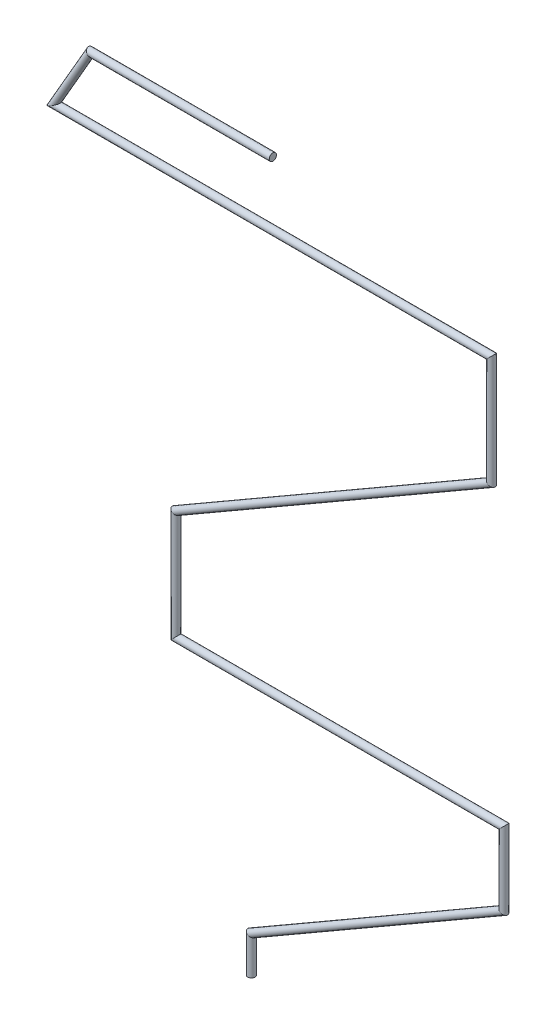
ISO-10303-21;
HEADER;
FILE_DESCRIPTION(('STEP AP214'),'2;1');
FILE_NAME('part.step','',(''),(''),'','','');
FILE_SCHEMA(('AUTOMOTIVE_DESIGN { 1 0 10303 214 1 1 1 1 }'));
ENDSEC;
DATA;
#1=APPLICATION_CONTEXT('core data for automotive mechanical design processes');
#2=APPLICATION_PROTOCOL_DEFINITION('international standard','automotive_design',2000,#1);
#3=PRODUCT_CONTEXT('',#1,'mechanical');
#4=PRODUCT('Part','Part','',(#3));
#5=PRODUCT_RELATED_PRODUCT_CATEGORY('part','',(#4));
#6=PRODUCT_DEFINITION_FORMATION('','',#4);
#7=PRODUCT_DEFINITION_CONTEXT('part definition',#1,'design');
#8=PRODUCT_DEFINITION('design','',#6,#7);
#9=PRODUCT_DEFINITION_SHAPE('','',#8);
#10=(LENGTH_UNIT() NAMED_UNIT(*) SI_UNIT(.MILLI.,.METRE.));
#11=(NAMED_UNIT(*) PLANE_ANGLE_UNIT() SI_UNIT($,.RADIAN.));
#12=(NAMED_UNIT(*) SI_UNIT($,.STERADIAN.) SOLID_ANGLE_UNIT());
#13=UNCERTAINTY_MEASURE_WITH_UNIT(LENGTH_MEASURE(1.E-05),#10,'distance_accuracy_value','');
#14=(GEOMETRIC_REPRESENTATION_CONTEXT(3) GLOBAL_UNCERTAINTY_ASSIGNED_CONTEXT((#13)) GLOBAL_UNIT_ASSIGNED_CONTEXT((#10,
#11,#12)) REPRESENTATION_CONTEXT('',''));
#15=CARTESIAN_POINT('',(0.,0.,0.));
#16=DIRECTION('',(0.,0.,1.));
#17=DIRECTION('',(1.,0.,0.));
#18=AXIS2_PLACEMENT_3D('',#15,#16,#17);
#19=CARTESIAN_POINT('',(2.9422863405995,98.660254037844,0.));
#20=DIRECTION('',(-1.,0.,0.));
#21=DIRECTION('',(0.,0.,1.));
#22=AXIS2_PLACEMENT_3D('',#19,#20,#21);
#23=PLANE('',#22);
#24=CARTESIAN_POINT('',(2.9422863405995,98.660254037844,0.));
#25=DIRECTION('',(-1.,0.,0.));
#26=DIRECTION('',(0.,0.,1.));
#27=AXIS2_PLACEMENT_3D('',#24,#25,#26);
#28=CIRCLE('',#27,0.5);
#29=CARTESIAN_POINT('',(2.9422863405995,98.660254037844,0.5));
#30=VERTEX_POINT('',#29);
#31=EDGE_CURVE('E46',#30,#30,#28,.T.);
#32=ORIENTED_EDGE('',*,*,#31,.F.);
#33=EDGE_LOOP('',(#32));
#34=FACE_BOUND('',#33,.T.);
#35=ADVANCED_FACE('F43',(#34),#23,.F.);
#36=CARTESIAN_POINT('',(0.,0.,0.));
#37=DIRECTION('',(0.,-1.,0.));
#38=DIRECTION('',(0.,0.,1.));
#39=AXIS2_PLACEMENT_3D('',#36,#37,#38);
#40=PLANE('',#39);
#41=CARTESIAN_POINT('',(0.,0.,0.));
#42=DIRECTION('',(0.,-1.,0.));
#43=DIRECTION('',(0.,0.,1.));
#44=AXIS2_PLACEMENT_3D('',#41,#42,#43);
#45=CIRCLE('',#44,0.5);
#46=CARTESIAN_POINT('',(0.,0.,0.5));
#47=VERTEX_POINT('',#46);
#48=EDGE_CURVE('E51',#47,#47,#45,.T.);
#49=ORIENTED_EDGE('',*,*,#48,.T.);
#50=EDGE_LOOP('',(#49));
#51=FACE_BOUND('',#50,.T.);
#52=ADVANCED_FACE('F98',(#51),#40,.T.);
#53=CARTESIAN_POINT('',(-22.7927989555091,98.660254037844,0.));
#54=DIRECTION('',(1.,0.,0.));
#55=DIRECTION('',(0.,0.,-1.));
#56=AXIS2_PLACEMENT_3D('',#53,#54,#55);
#57=CYLINDRICAL_SURFACE('',#56,0.5);
#58=CARTESIAN_POINT('',(-22.0577136594005,98.660254037844,0.));
#59=DIRECTION('',(0.866025403784444,0.499999999999991,0.));
#60=DIRECTION('',(-0.499999999999991,0.866025403784444,0.));
#61=AXIS2_PLACEMENT_3D('',#58,#59,#60);
#62=ELLIPSE('',#61,0.577350269189622,0.5);
#63=CARTESIAN_POINT('',(-22.3463887939953,99.160254037844,0.));
#64=VERTEX_POINT('',#63);
#65=EDGE_CURVE('E86',#64,#64,#62,.T.);
#66=ORIENTED_EDGE('',*,*,#65,.T.);
#67=EDGE_LOOP('',(#66));
#68=FACE_BOUND('',#67,.T.);
#69=ORIENTED_EDGE('',*,*,#31,.T.);
#70=EDGE_LOOP('',(#69));
#71=FACE_BOUND('',#70,.T.);
#72=ADVANCED_FACE('F95',(#68,#71),#57,.T.);
#73=CARTESIAN_POINT('',(-28.0603416035635,88.2633974596215,0.));
#74=DIRECTION('',(0.500000000000018,0.866025403784428,0.));
#75=DIRECTION('',(-0.866025403784428,0.500000000000018,0.));
#76=AXIS2_PLACEMENT_3D('',#73,#74,#75);
#77=CYLINDRICAL_SURFACE('',#76,0.5);
#78=CARTESIAN_POINT('',(-27.0577136594005,90.,0.));
#79=DIRECTION('',(-0.499999999999991,0.866025403784444,0.));
#80=DIRECTION('',(-0.866025403784444,-0.499999999999991,0.));
#81=AXIS2_PLACEMENT_3D('',#78,#79,#80);
#82=ELLIPSE('',#81,1.00000000000002,0.5);
#83=CARTESIAN_POINT('',(-27.923739063185,89.5,0.));
#84=VERTEX_POINT('',#83);
#85=EDGE_CURVE('E83',#84,#84,#82,.T.);
#86=ORIENTED_EDGE('',*,*,#85,.T.);
#87=EDGE_LOOP('',(#86));
#88=FACE_BOUND('',#87,.T.);
#89=ORIENTED_EDGE('',*,*,#65,.F.);
#90=EDGE_LOOP('',(#89));
#91=FACE_BOUND('',#90,.T.);
#92=ADVANCED_FACE('F138',(#88,#91),#77,.T.);
#93=CARTESIAN_POINT('',(34.1422863405995,90.,0.));
#94=DIRECTION('',(-1.,0.,0.));
#95=DIRECTION('',(0.,0.,1.));
#96=AXIS2_PLACEMENT_3D('',#93,#94,#95);
#97=CYLINDRICAL_SURFACE('',#96,0.5);
#98=CARTESIAN_POINT('',(32.9422863405995,90.,0.));
#99=DIRECTION('',(-0.707106781186548,0.707106781186548,0.));
#100=DIRECTION('',(0.707106781186548,0.707106781186548,0.));
#101=AXIS2_PLACEMENT_3D('',#98,#99,#100);
#102=ELLIPSE('',#101,0.707106781186547,0.5);
#103=CARTESIAN_POINT('',(33.4422863405995,90.5,0.));
#104=VERTEX_POINT('',#103);
#105=EDGE_CURVE('E79',#104,#104,#102,.T.);
#106=ORIENTED_EDGE('',*,*,#105,.T.);
#107=EDGE_LOOP('',(#106));
#108=FACE_BOUND('',#107,.T.);
#109=ORIENTED_EDGE('',*,*,#85,.F.);
#110=EDGE_LOOP('',(#109));
#111=FACE_BOUND('',#110,.T.);
#112=ADVANCED_FACE('F134',(#108,#111),#97,.T.);
#113=CARTESIAN_POINT('',(32.9422863405995,74.2649147038914,0.));
#114=DIRECTION('',(0.,1.,0.));
#115=DIRECTION('',(0.,0.,1.));
#116=AXIS2_PLACEMENT_3D('',#113,#114,#115);
#117=CYLINDRICAL_SURFACE('',#116,0.5);
#118=CARTESIAN_POINT('',(32.9422863405994,75.,0.));
#119=DIRECTION('',(0.5,0.866025403784439,0.));
#120=DIRECTION('',(0.866025403784439,-0.5,0.));
#121=AXIS2_PLACEMENT_3D('',#118,#119,#120);
#122=ELLIPSE('',#121,0.577350269189626,0.5);
#123=CARTESIAN_POINT('',(33.4422863405994,74.7113248654052,0.));
#124=VERTEX_POINT('',#123);
#125=EDGE_CURVE('E75',#124,#124,#122,.T.);
#126=ORIENTED_EDGE('',*,*,#125,.T.);
#127=EDGE_LOOP('',(#126));
#128=FACE_BOUND('',#127,.T.);
#129=ORIENTED_EDGE('',*,*,#105,.F.);
#130=EDGE_LOOP('',(#129));
#131=FACE_BOUND('',#130,.T.);
#132=ADVANCED_FACE('F130',(#128,#131),#117,.T.);
#133=CARTESIAN_POINT('',(-10.9955863890009,49.6324573519457,0.));
#134=DIRECTION('',(0.866025403784439,0.5,0.));
#135=DIRECTION('',(-0.5,0.866025403784439,0.));
#136=AXIS2_PLACEMENT_3D('',#133,#134,#135);
#137=CYLINDRICAL_SURFACE('',#136,0.5);
#138=CARTESIAN_POINT('',(-10.3589838486225,50.,0.));
#139=DIRECTION('',(0.5,0.866025403784439,0.));
#140=DIRECTION('',(-0.866025403784439,0.5,0.));
#141=AXIS2_PLACEMENT_3D('',#138,#139,#140);
#142=ELLIPSE('',#141,0.577350269189626,0.5);
#143=CARTESIAN_POINT('',(-10.8589838486225,50.2886751345948,0.));
#144=VERTEX_POINT('',#143);
#145=EDGE_CURVE('E71',#144,#144,#142,.T.);
#146=ORIENTED_EDGE('',*,*,#145,.T.);
#147=EDGE_LOOP('',(#146));
#148=FACE_BOUND('',#147,.T.);
#149=ORIENTED_EDGE('',*,*,#125,.F.);
#150=EDGE_LOOP('',(#149));
#151=FACE_BOUND('',#150,.T.);
#152=ADVANCED_FACE('F126',(#148,#151),#137,.T.);
#153=CARTESIAN_POINT('',(-10.3589838486225,33.8,0.));
#154=DIRECTION('',(0.,1.,0.));
#155=DIRECTION('',(0.,0.,1.));
#156=AXIS2_PLACEMENT_3D('',#153,#154,#155);
#157=CYLINDRICAL_SURFACE('',#156,0.5);
#158=CARTESIAN_POINT('',(-10.3589838486225,35.,0.));
#159=DIRECTION('',(-0.707106781186548,0.707106781186548,0.));
#160=DIRECTION('',(-0.707106781186548,-0.707106781186548,0.));
#161=AXIS2_PLACEMENT_3D('',#158,#159,#160);
#162=ELLIPSE('',#161,0.707106781186547,0.5);
#163=CARTESIAN_POINT('',(-10.8589838486225,34.5,0.));
#164=VERTEX_POINT('',#163);
#165=EDGE_CURVE('E67',#164,#164,#162,.T.);
#166=ORIENTED_EDGE('',*,*,#165,.T.);
#167=EDGE_LOOP('',(#166));
#168=FACE_BOUND('',#167,.T.);
#169=ORIENTED_EDGE('',*,*,#145,.F.);
#170=EDGE_LOOP('',(#169));
#171=FACE_BOUND('',#170,.T.);
#172=ADVANCED_FACE('F122',(#168,#171),#157,.T.);
#173=CARTESIAN_POINT('',(35.8410161513775,35.,0.));
#174=DIRECTION('',(-1.,0.,0.));
#175=DIRECTION('',(0.,0.,1.));
#176=AXIS2_PLACEMENT_3D('',#173,#174,#175);
#177=CYLINDRICAL_SURFACE('',#176,0.5);
#178=CARTESIAN_POINT('',(34.6410161513775,35.,0.));
#179=DIRECTION('',(-0.707106781186548,0.707106781186548,0.));
#180=DIRECTION('',(0.707106781186548,0.707106781186548,0.));
#181=AXIS2_PLACEMENT_3D('',#178,#179,#180);
#182=ELLIPSE('',#181,0.707106781186547,0.5);
#183=CARTESIAN_POINT('',(35.1410161513775,35.5,0.));
#184=VERTEX_POINT('',#183);
#185=EDGE_CURVE('E63',#184,#184,#182,.T.);
#186=ORIENTED_EDGE('',*,*,#185,.T.);
#187=EDGE_LOOP('',(#186));
#188=FACE_BOUND('',#187,.T.);
#189=ORIENTED_EDGE('',*,*,#165,.F.);
#190=EDGE_LOOP('',(#189));
#191=FACE_BOUND('',#190,.T.);
#192=ADVANCED_FACE('F118',(#188,#191),#177,.T.);
#193=CARTESIAN_POINT('',(34.6410161513775,24.2649147038915,0.));
#194=DIRECTION('',(0.,1.,0.));
#195=DIRECTION('',(0.,0.,1.));
#196=AXIS2_PLACEMENT_3D('',#193,#194,#195);
#197=CYLINDRICAL_SURFACE('',#196,0.5);
#198=CARTESIAN_POINT('',(34.6410161513775,25.,0.));
#199=DIRECTION('',(0.5,0.866025403784439,0.));
#200=DIRECTION('',(0.866025403784439,-0.5,0.));
#201=AXIS2_PLACEMENT_3D('',#198,#199,#200);
#202=ELLIPSE('',#201,0.577350269189626,0.5);
#203=CARTESIAN_POINT('',(35.1410161513775,24.7113248654052,0.));
#204=VERTEX_POINT('',#203);
#205=EDGE_CURVE('E57',#204,#204,#202,.T.);
#206=ORIENTED_EDGE('',*,*,#205,.T.);
#207=EDGE_LOOP('',(#206));
#208=FACE_BOUND('',#207,.T.);
#209=ORIENTED_EDGE('',*,*,#185,.F.);
#210=EDGE_LOOP('',(#209));
#211=FACE_BOUND('',#210,.T.);
#212=ADVANCED_FACE('F111',(#208,#211),#197,.T.);
#213=CARTESIAN_POINT('',(-0.636602540378485,4.63245735194571,0.));
#214=DIRECTION('',(0.866025403784439,0.5,0.));
#215=DIRECTION('',(-0.5,0.866025403784439,0.));
#216=AXIS2_PLACEMENT_3D('',#213,#214,#215);
#217=CYLINDRICAL_SURFACE('',#216,0.5);
#218=CARTESIAN_POINT('',(0.,5.00000000000002,0.));
#219=DIRECTION('',(0.5,0.866025403784439,0.));
#220=DIRECTION('',(-0.866025403784439,0.5,0.));
#221=AXIS2_PLACEMENT_3D('',#218,#219,#220);
#222=ELLIPSE('',#221,0.577350269189626,0.5);
#223=CARTESIAN_POINT('',(-0.500000000000042,5.28867513459484,0.));
#224=VERTEX_POINT('',#223);
#225=EDGE_CURVE('E11',#224,#224,#222,.T.);
#226=ORIENTED_EDGE('',*,*,#225,.T.);
#227=EDGE_LOOP('',(#226));
#228=FACE_BOUND('',#227,.T.);
#229=ORIENTED_EDGE('',*,*,#205,.F.);
#230=EDGE_LOOP('',(#229));
#231=FACE_BOUND('',#230,.T.);
#232=ADVANCED_FACE('F105',(#228,#231),#217,.T.);
#233=CARTESIAN_POINT('',(0.,0.,0.));
#234=DIRECTION('',(0.,1.,0.));
#235=DIRECTION('',(0.,0.,1.));
#236=AXIS2_PLACEMENT_3D('',#233,#234,#235);
#237=CYLINDRICAL_SURFACE('',#236,0.5);
#238=ORIENTED_EDGE('',*,*,#48,.F.);
#239=EDGE_LOOP('',(#238));
#240=FACE_BOUND('',#239,.T.);
#241=ORIENTED_EDGE('',*,*,#225,.F.);
#242=EDGE_LOOP('',(#241));
#243=FACE_BOUND('',#242,.T.);
#244=ADVANCED_FACE('F103',(#240,#243),#237,.T.);
#245=CLOSED_SHELL('',(#35,#52,#72,#92,#112,#132,#152,#172,#192,#212,#232,#244));
#246=MANIFOLD_SOLID_BREP('B2',#245);
#247=ADVANCED_BREP_SHAPE_REPRESENTATION('',(#18,#246),#14);
#248=SHAPE_DEFINITION_REPRESENTATION(#9,#247);
ENDSEC;
END-ISO-10303-21;
